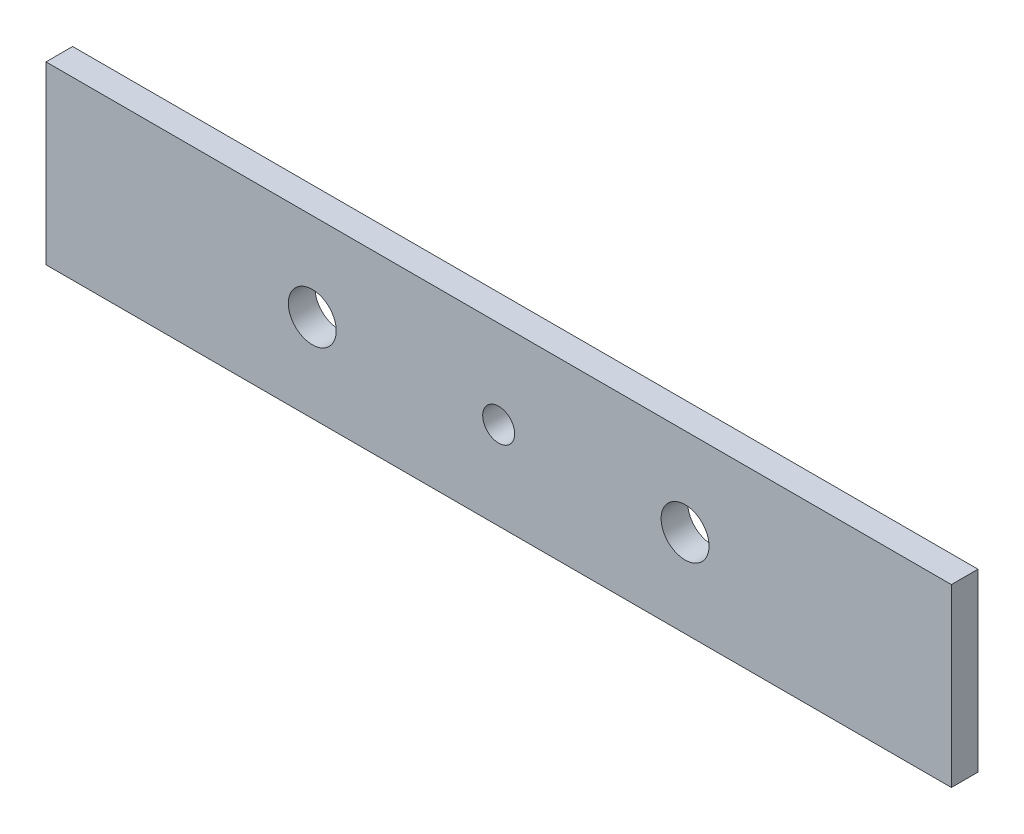
ISO-10303-21;
HEADER;
FILE_DESCRIPTION(('STEP AP214'),'2;1');
FILE_NAME('part.step','',(''),(''),'','','');
FILE_SCHEMA(('AUTOMOTIVE_DESIGN { 1 0 10303 214 1 1 1 1 }'));
ENDSEC;
DATA;
#1=APPLICATION_CONTEXT('core data for automotive mechanical design processes');
#2=APPLICATION_PROTOCOL_DEFINITION('international standard','automotive_design',2000,#1);
#3=PRODUCT_CONTEXT('',#1,'mechanical');
#4=PRODUCT('Part','Part','',(#3));
#5=PRODUCT_RELATED_PRODUCT_CATEGORY('part','',(#4));
#6=PRODUCT_DEFINITION_FORMATION('','',#4);
#7=PRODUCT_DEFINITION_CONTEXT('part definition',#1,'design');
#8=PRODUCT_DEFINITION('design','',#6,#7);
#9=PRODUCT_DEFINITION_SHAPE('','',#8);
#10=(LENGTH_UNIT() NAMED_UNIT(*) SI_UNIT(.MILLI.,.METRE.));
#11=(NAMED_UNIT(*) PLANE_ANGLE_UNIT() SI_UNIT($,.RADIAN.));
#12=(NAMED_UNIT(*) SI_UNIT($,.STERADIAN.) SOLID_ANGLE_UNIT());
#13=UNCERTAINTY_MEASURE_WITH_UNIT(LENGTH_MEASURE(1.E-05),#10,'distance_accuracy_value','');
#14=(GEOMETRIC_REPRESENTATION_CONTEXT(3) GLOBAL_UNCERTAINTY_ASSIGNED_CONTEXT((#13)) GLOBAL_UNIT_ASSIGNED_CONTEXT((#10,
#11,#12)) REPRESENTATION_CONTEXT('',''));
#15=CARTESIAN_POINT('',(0.,0.,0.));
#16=DIRECTION('',(0.,0.,1.));
#17=DIRECTION('',(1.,0.,0.));
#18=AXIS2_PLACEMENT_3D('',#15,#16,#17);
#19=CARTESIAN_POINT('',(0.,33.,0.));
#20=DIRECTION('',(1.,0.,0.));
#21=DIRECTION('',(0.,0.,-1.));
#22=AXIS2_PLACEMENT_3D('',#19,#20,#21);
#23=PLANE('',#22);
#24=DIRECTION('',(0.,0.,1.));
#25=VECTOR('',#24,1.);
#26=CARTESIAN_POINT('',(0.,0.,0.));
#27=LINE('',#26,#25);
#28=CARTESIAN_POINT('',(0.,0.,-5.));
#29=VERTEX_POINT('',#28);
#30=CARTESIAN_POINT('',(0.,0.,0.));
#31=VERTEX_POINT('',#30);
#32=EDGE_CURVE('E98',#29,#31,#27,.T.);
#33=ORIENTED_EDGE('',*,*,#32,.T.);
#34=DIRECTION('',(0.,-1.,0.));
#35=VECTOR('',#34,1.);
#36=CARTESIAN_POINT('',(0.,33.,0.));
#37=LINE('',#36,#35);
#38=CARTESIAN_POINT('',(0.,33.,0.));
#39=VERTEX_POINT('',#38);
#40=EDGE_CURVE('E11',#39,#31,#37,.T.);
#41=ORIENTED_EDGE('',*,*,#40,.F.);
#42=DIRECTION('',(0.,0.,1.));
#43=VECTOR('',#42,1.);
#44=CARTESIAN_POINT('',(0.,33.,0.));
#45=LINE('',#44,#43);
#46=CARTESIAN_POINT('',(0.,33.,-5.));
#47=VERTEX_POINT('',#46);
#48=EDGE_CURVE('E85',#47,#39,#45,.T.);
#49=ORIENTED_EDGE('',*,*,#48,.F.);
#50=DIRECTION('',(0.,-1.,0.));
#51=VECTOR('',#50,1.);
#52=CARTESIAN_POINT('',(0.,33.,-5.));
#53=LINE('',#52,#51);
#54=EDGE_CURVE('E94',#47,#29,#53,.T.);
#55=ORIENTED_EDGE('',*,*,#54,.T.);
#56=EDGE_LOOP('',(#33,#41,#49,#55));
#57=FACE_BOUND('',#56,.T.);
#58=ADVANCED_FACE('F32',(#57),#23,.F.);
#59=CARTESIAN_POINT('',(0.,33.,0.));
#60=DIRECTION('',(0.,0.,-1.));
#61=DIRECTION('',(-1.,0.,0.));
#62=AXIS2_PLACEMENT_3D('',#59,#60,#61);
#63=PLANE('',#62);
#64=CARTESIAN_POINT('',(120.,16.5,0.));
#65=DIRECTION('',(0.,0.,1.));
#66=DIRECTION('',(1.,0.,0.));
#67=AXIS2_PLACEMENT_3D('',#64,#65,#66);
#68=CIRCLE('',#67,4.49999999999999);
#69=CARTESIAN_POINT('',(124.5,16.5,0.));
#70=VERTEX_POINT('',#69);
#71=EDGE_CURVE('E209',#70,#70,#68,.T.);
#72=ORIENTED_EDGE('',*,*,#71,.F.);
#73=EDGE_LOOP('',(#72));
#74=FACE_BOUND('',#73,.T.);
#75=CARTESIAN_POINT('',(50.,16.5,0.));
#76=DIRECTION('',(0.,0.,1.));
#77=DIRECTION('',(1.,0.,0.));
#78=AXIS2_PLACEMENT_3D('',#75,#76,#77);
#79=CIRCLE('',#78,4.5);
#80=CARTESIAN_POINT('',(54.5,16.5,0.));
#81=VERTEX_POINT('',#80);
#82=EDGE_CURVE('E206',#81,#81,#79,.T.);
#83=ORIENTED_EDGE('',*,*,#82,.F.);
#84=EDGE_LOOP('',(#83));
#85=FACE_BOUND('',#84,.T.);
#86=CARTESIAN_POINT('',(85.,16.5,0.));
#87=DIRECTION('',(0.,0.,1.));
#88=DIRECTION('',(1.,0.,0.));
#89=AXIS2_PLACEMENT_3D('',#86,#87,#88);
#90=CIRCLE('',#89,3.00000000000001);
#91=CARTESIAN_POINT('',(88.,16.5,0.));
#92=VERTEX_POINT('',#91);
#93=EDGE_CURVE('E109',#92,#92,#90,.T.);
#94=ORIENTED_EDGE('',*,*,#93,.F.);
#95=EDGE_LOOP('',(#94));
#96=FACE_BOUND('',#95,.T.);
#97=DIRECTION('',(1.,0.,0.));
#98=VECTOR('',#97,1.);
#99=CARTESIAN_POINT('',(0.,0.,0.));
#100=LINE('',#99,#98);
#101=CARTESIAN_POINT('',(170.,0.,0.));
#102=VERTEX_POINT('',#101);
#103=EDGE_CURVE('E89',#31,#102,#100,.T.);
#104=ORIENTED_EDGE('',*,*,#103,.T.);
#105=DIRECTION('',(0.,-1.,0.));
#106=VECTOR('',#105,1.);
#107=CARTESIAN_POINT('',(170.,33.,0.));
#108=LINE('',#107,#106);
#109=CARTESIAN_POINT('',(170.,33.,0.));
#110=VERTEX_POINT('',#109);
#111=EDGE_CURVE('E41',#110,#102,#108,.T.);
#112=ORIENTED_EDGE('',*,*,#111,.F.);
#113=DIRECTION('',(1.,0.,0.));
#114=VECTOR('',#113,1.);
#115=CARTESIAN_POINT('',(0.,33.,0.));
#116=LINE('',#115,#114);
#117=EDGE_CURVE('E80',#39,#110,#116,.T.);
#118=ORIENTED_EDGE('',*,*,#117,.F.);
#119=ORIENTED_EDGE('',*,*,#40,.T.);
#120=EDGE_LOOP('',(#104,#112,#118,#119));
#121=FACE_BOUND('',#120,.T.);
#122=ADVANCED_FACE('F88',(#74,#85,#96,#121),#63,.F.);
#123=CARTESIAN_POINT('',(170.,33.,0.));
#124=DIRECTION('',(-1.,0.,0.));
#125=DIRECTION('',(0.,0.,1.));
#126=AXIS2_PLACEMENT_3D('',#123,#124,#125);
#127=PLANE('',#126);
#128=DIRECTION('',(0.,0.,-1.));
#129=VECTOR('',#128,1.);
#130=CARTESIAN_POINT('',(170.,0.,0.));
#131=LINE('',#130,#129);
#132=CARTESIAN_POINT('',(170.,0.,-5.));
#133=VERTEX_POINT('',#132);
#134=EDGE_CURVE('E67',#102,#133,#131,.T.);
#135=ORIENTED_EDGE('',*,*,#134,.T.);
#136=DIRECTION('',(0.,-1.,0.));
#137=VECTOR('',#136,1.);
#138=CARTESIAN_POINT('',(170.,33.,-5.));
#139=LINE('',#138,#137);
#140=CARTESIAN_POINT('',(170.,33.,-5.));
#141=VERTEX_POINT('',#140);
#142=EDGE_CURVE('E90',#141,#133,#139,.T.);
#143=ORIENTED_EDGE('',*,*,#142,.F.);
#144=DIRECTION('',(0.,0.,-1.));
#145=VECTOR('',#144,1.);
#146=CARTESIAN_POINT('',(170.,33.,0.));
#147=LINE('',#146,#145);
#148=EDGE_CURVE('E83',#110,#141,#147,.T.);
#149=ORIENTED_EDGE('',*,*,#148,.F.);
#150=ORIENTED_EDGE('',*,*,#111,.T.);
#151=EDGE_LOOP('',(#135,#143,#149,#150));
#152=FACE_BOUND('',#151,.T.);
#153=ADVANCED_FACE('F92',(#152),#127,.F.);
#154=CARTESIAN_POINT('',(0.,33.,-5.));
#155=DIRECTION('',(0.,0.,1.));
#156=DIRECTION('',(1.,0.,0.));
#157=AXIS2_PLACEMENT_3D('',#154,#155,#156);
#158=PLANE('',#157);
#159=CARTESIAN_POINT('',(120.,16.5,-5.));
#160=DIRECTION('',(0.,0.,1.));
#161=DIRECTION('',(1.,0.,0.));
#162=AXIS2_PLACEMENT_3D('',#159,#160,#161);
#163=CIRCLE('',#162,4.49999999999999);
#164=CARTESIAN_POINT('',(124.5,16.5,-5.));
#165=VERTEX_POINT('',#164);
#166=EDGE_CURVE('E35',#165,#165,#163,.T.);
#167=ORIENTED_EDGE('',*,*,#166,.T.);
#168=EDGE_LOOP('',(#167));
#169=FACE_BOUND('',#168,.T.);
#170=CARTESIAN_POINT('',(50.,16.5,-5.));
#171=DIRECTION('',(0.,0.,1.));
#172=DIRECTION('',(1.,0.,0.));
#173=AXIS2_PLACEMENT_3D('',#170,#171,#172);
#174=CIRCLE('',#173,4.5);
#175=CARTESIAN_POINT('',(54.5,16.5,-5.));
#176=VERTEX_POINT('',#175);
#177=EDGE_CURVE('E108',#176,#176,#174,.T.);
#178=ORIENTED_EDGE('',*,*,#177,.T.);
#179=EDGE_LOOP('',(#178));
#180=FACE_BOUND('',#179,.T.);
#181=CARTESIAN_POINT('',(85.,16.5,-5.));
#182=DIRECTION('',(0.,0.,1.));
#183=DIRECTION('',(1.,0.,0.));
#184=AXIS2_PLACEMENT_3D('',#181,#182,#183);
#185=CIRCLE('',#184,3.00000000000001);
#186=CARTESIAN_POINT('',(88.,16.5,-5.));
#187=VERTEX_POINT('',#186);
#188=EDGE_CURVE('E106',#187,#187,#185,.T.);
#189=ORIENTED_EDGE('',*,*,#188,.T.);
#190=EDGE_LOOP('',(#189));
#191=FACE_BOUND('',#190,.T.);
#192=DIRECTION('',(-1.,0.,0.));
#193=VECTOR('',#192,1.);
#194=CARTESIAN_POINT('',(0.,0.,-5.));
#195=LINE('',#194,#193);
#196=EDGE_CURVE('E73',#133,#29,#195,.T.);
#197=ORIENTED_EDGE('',*,*,#196,.T.);
#198=ORIENTED_EDGE('',*,*,#54,.F.);
#199=DIRECTION('',(-1.,0.,0.));
#200=VECTOR('',#199,1.);
#201=CARTESIAN_POINT('',(0.,33.,-5.));
#202=LINE('',#201,#200);
#203=EDGE_CURVE('E50',#141,#47,#202,.T.);
#204=ORIENTED_EDGE('',*,*,#203,.F.);
#205=ORIENTED_EDGE('',*,*,#142,.T.);
#206=EDGE_LOOP('',(#197,#198,#204,#205));
#207=FACE_BOUND('',#206,.T.);
#208=ADVANCED_FACE('F116',(#169,#180,#191,#207),#158,.F.);
#209=CARTESIAN_POINT('',(0.,33.,0.));
#210=DIRECTION('',(0.,-1.,0.));
#211=DIRECTION('',(0.,0.,-1.));
#212=AXIS2_PLACEMENT_3D('',#209,#210,#211);
#213=PLANE('',#212);
#214=ORIENTED_EDGE('',*,*,#48,.T.);
#215=ORIENTED_EDGE('',*,*,#117,.T.);
#216=ORIENTED_EDGE('',*,*,#148,.T.);
#217=ORIENTED_EDGE('',*,*,#203,.T.);
#218=EDGE_LOOP('',(#214,#215,#216,#217));
#219=FACE_BOUND('',#218,.T.);
#220=ADVANCED_FACE('F81',(#219),#213,.F.);
#221=CARTESIAN_POINT('',(0.,0.,0.));
#222=DIRECTION('',(0.,-1.,0.));
#223=DIRECTION('',(0.,0.,-1.));
#224=AXIS2_PLACEMENT_3D('',#221,#222,#223);
#225=PLANE('',#224);
#226=ORIENTED_EDGE('',*,*,#32,.F.);
#227=ORIENTED_EDGE('',*,*,#196,.F.);
#228=ORIENTED_EDGE('',*,*,#134,.F.);
#229=ORIENTED_EDGE('',*,*,#103,.F.);
#230=EDGE_LOOP('',(#226,#227,#228,#229));
#231=FACE_BOUND('',#230,.T.);
#232=ADVANCED_FACE('F139',(#231),#225,.T.);
#233=CARTESIAN_POINT('',(85.,16.5,-29.));
#234=DIRECTION('',(0.,0.,1.));
#235=DIRECTION('',(1.,0.,0.));
#236=AXIS2_PLACEMENT_3D('',#233,#234,#235);
#237=CYLINDRICAL_SURFACE('',#236,3.00000000000001);
#238=CARTESIAN_POINT('',(88.,16.5,0.));
#239=CARTESIAN_POINT('',(88.,16.5,-0.0520833333333334));
#240=CARTESIAN_POINT('',(88.,16.5,-0.104166666666667));
#241=CARTESIAN_POINT('',(88.,16.5,-0.208333333333334));
#242=CARTESIAN_POINT('',(88.,16.5,-0.260416666666667));
#243=CARTESIAN_POINT('',(88.,16.5,-0.364583333333334));
#244=CARTESIAN_POINT('',(88.,16.5,-0.416666666666667));
#245=CARTESIAN_POINT('',(88.,16.5,-0.520833333333334));
#246=CARTESIAN_POINT('',(88.,16.5,-0.572916666666667));
#247=CARTESIAN_POINT('',(88.,16.5,-0.677083333333334));
#248=CARTESIAN_POINT('',(88.,16.5,-0.729166666666667));
#249=CARTESIAN_POINT('',(88.,16.5,-0.833333333333334));
#250=CARTESIAN_POINT('',(88.,16.5,-0.885416666666668));
#251=CARTESIAN_POINT('',(88.,16.5,-0.989583333333334));
#252=CARTESIAN_POINT('',(88.,16.5,-1.04166666666667));
#253=CARTESIAN_POINT('',(88.,16.5,-1.14583333333333));
#254=CARTESIAN_POINT('',(88.,16.5,-1.19791666666667));
#255=CARTESIAN_POINT('',(88.,16.5,-1.30208333333333));
#256=CARTESIAN_POINT('',(88.,16.5,-1.35416666666667));
#257=CARTESIAN_POINT('',(88.,16.5,-1.45833333333333));
#258=CARTESIAN_POINT('',(88.,16.5,-1.51041666666667));
#259=CARTESIAN_POINT('',(88.,16.5,-1.61458333333333));
#260=CARTESIAN_POINT('',(88.,16.5,-1.66666666666667));
#261=CARTESIAN_POINT('',(88.,16.5,-1.77083333333334));
#262=CARTESIAN_POINT('',(88.,16.5,-1.82291666666667));
#263=CARTESIAN_POINT('',(88.,16.5,-1.92708333333334));
#264=CARTESIAN_POINT('',(88.,16.5,-1.97916666666667));
#265=CARTESIAN_POINT('',(88.,16.5,-2.08333333333334));
#266=CARTESIAN_POINT('',(88.,16.5,-2.13541666666667));
#267=CARTESIAN_POINT('',(88.,16.5,-2.23958333333334));
#268=CARTESIAN_POINT('',(88.,16.5,-2.29166666666667));
#269=CARTESIAN_POINT('',(88.,16.5,-2.39583333333334));
#270=CARTESIAN_POINT('',(88.,16.5,-2.44791666666667));
#271=CARTESIAN_POINT('',(88.,16.5,-2.55208333333334));
#272=CARTESIAN_POINT('',(88.,16.5,-2.60416666666667));
#273=CARTESIAN_POINT('',(88.,16.5,-2.70833333333334));
#274=CARTESIAN_POINT('',(88.,16.5,-2.76041666666667));
#275=CARTESIAN_POINT('',(88.,16.5,-2.86458333333334));
#276=CARTESIAN_POINT('',(88.,16.5,-2.91666666666667));
#277=CARTESIAN_POINT('',(88.,16.5,-3.02083333333334));
#278=CARTESIAN_POINT('',(88.,16.5,-3.07291666666667));
#279=CARTESIAN_POINT('',(88.,16.5,-3.17708333333334));
#280=CARTESIAN_POINT('',(88.,16.5,-3.22916666666667));
#281=CARTESIAN_POINT('',(88.,16.5,-3.33333333333334));
#282=CARTESIAN_POINT('',(88.,16.5,-3.38541666666667));
#283=CARTESIAN_POINT('',(88.,16.5,-3.48958333333334));
#284=CARTESIAN_POINT('',(88.,16.5,-3.54166666666667));
#285=CARTESIAN_POINT('',(88.,16.5,-3.64583333333334));
#286=CARTESIAN_POINT('',(88.,16.5,-3.69791666666667));
#287=CARTESIAN_POINT('',(88.,16.5,-3.80208333333334));
#288=CARTESIAN_POINT('',(88.,16.5,-3.85416666666667));
#289=CARTESIAN_POINT('',(88.,16.5,-3.95833333333334));
#290=CARTESIAN_POINT('',(88.,16.5,-4.01041666666667));
#291=CARTESIAN_POINT('',(88.,16.5,-4.11458333333334));
#292=CARTESIAN_POINT('',(88.,16.5,-4.16666666666667));
#293=CARTESIAN_POINT('',(88.,16.5,-4.27083333333334));
#294=CARTESIAN_POINT('',(88.,16.5,-4.32291666666667));
#295=CARTESIAN_POINT('',(88.,16.5,-4.42708333333334));
#296=CARTESIAN_POINT('',(88.,16.5,-4.47916666666667));
#297=CARTESIAN_POINT('',(88.,16.5,-4.58333333333334));
#298=CARTESIAN_POINT('',(88.,16.5,-4.63541666666667));
#299=CARTESIAN_POINT('',(88.,16.5,-4.73958333333334));
#300=CARTESIAN_POINT('',(88.,16.5,-4.79166666666667));
#301=CARTESIAN_POINT('',(88.,16.5,-4.89583333333334));
#302=CARTESIAN_POINT('',(88.,16.5,-4.94791666666667));
#303=CARTESIAN_POINT('',(88.,16.5,-5.));
#304=B_SPLINE_CURVE_WITH_KNOTS('',3,(#238,#239,#240,#241,#242,#243,#244,#245,#246,#247,#248,
#249,#250,#251,#252,#253,#254,#255,#256,#257,#258,#259,#260,#261,#262,#263,#264,#265,#266,#267,
#268,#269,#270,#271,#272,#273,#274,#275,#276,#277,#278,#279,#280,#281,#282,#283,#284,#285,#286,
#287,#288,#289,#290,#291,#292,#293,#294,#295,#296,#297,#298,#299,#300,#301,#302,#303),
.UNSPECIFIED.,.F.,.F.,(4,2,2,2,2,2,2,2,2,2,2,2,2,2,2,2,2,2,2,2,2,2,2,2,2,2,2,2,2,2,2,2,4),(0.,
0.15625,0.3125,0.46875,0.625000000000001,0.781250000000001,0.937500000000001,1.09375,1.25,
1.40625,1.5625,1.71875,1.875,2.03125,2.1875,2.34375,2.5,2.65625,2.8125,2.96875,3.125,3.28125,
3.4375,3.59375,3.75,3.90625,4.0625,4.21875,4.375,4.53125,4.6875,4.84375,5.),.UNSPECIFIED.);
#305=EDGE_CURVE('BSEAM126',#92,#187,#304,.T.);
#306=ORIENTED_EDGE('',*,*,#93,.T.);
#307=ORIENTED_EDGE('',*,*,#188,.F.);
#308=ORIENTED_EDGE('',*,*,#305,.T.);
#309=ORIENTED_EDGE('',*,*,#305,.F.);
#310=EDGE_LOOP('',(#306,#308,#307,#309));
#311=FACE_BOUND('',#310,.T.);
#312=ADVANCED_FACE('F126',(#311),#237,.F.);
#313=CARTESIAN_POINT('',(50.,16.5,-29.));
#314=DIRECTION('',(0.,0.,1.));
#315=DIRECTION('',(1.,0.,0.));
#316=AXIS2_PLACEMENT_3D('',#313,#314,#315);
#317=CYLINDRICAL_SURFACE('',#316,4.5);
#318=CARTESIAN_POINT('',(54.5,16.5,0.));
#319=CARTESIAN_POINT('',(54.5,16.5,-0.0520833333333334));
#320=CARTESIAN_POINT('',(54.5,16.5,-0.104166666666667));
#321=CARTESIAN_POINT('',(54.5,16.5,-0.208333333333334));
#322=CARTESIAN_POINT('',(54.5,16.5,-0.260416666666667));
#323=CARTESIAN_POINT('',(54.5,16.5,-0.364583333333334));
#324=CARTESIAN_POINT('',(54.5,16.5,-0.416666666666667));
#325=CARTESIAN_POINT('',(54.5,16.5,-0.520833333333334));
#326=CARTESIAN_POINT('',(54.5,16.5,-0.572916666666667));
#327=CARTESIAN_POINT('',(54.5,16.5,-0.677083333333334));
#328=CARTESIAN_POINT('',(54.5,16.5,-0.729166666666667));
#329=CARTESIAN_POINT('',(54.5,16.5,-0.833333333333334));
#330=CARTESIAN_POINT('',(54.5,16.5,-0.885416666666668));
#331=CARTESIAN_POINT('',(54.5,16.5,-0.989583333333334));
#332=CARTESIAN_POINT('',(54.5,16.5,-1.04166666666667));
#333=CARTESIAN_POINT('',(54.5,16.5,-1.14583333333333));
#334=CARTESIAN_POINT('',(54.5,16.5,-1.19791666666667));
#335=CARTESIAN_POINT('',(54.5,16.5,-1.30208333333333));
#336=CARTESIAN_POINT('',(54.5,16.5,-1.35416666666667));
#337=CARTESIAN_POINT('',(54.5,16.5,-1.45833333333333));
#338=CARTESIAN_POINT('',(54.5,16.5,-1.51041666666667));
#339=CARTESIAN_POINT('',(54.5,16.5,-1.61458333333333));
#340=CARTESIAN_POINT('',(54.5,16.5,-1.66666666666667));
#341=CARTESIAN_POINT('',(54.5,16.5,-1.77083333333334));
#342=CARTESIAN_POINT('',(54.5,16.5,-1.82291666666667));
#343=CARTESIAN_POINT('',(54.5,16.5,-1.92708333333334));
#344=CARTESIAN_POINT('',(54.5,16.5,-1.97916666666667));
#345=CARTESIAN_POINT('',(54.5,16.5,-2.08333333333334));
#346=CARTESIAN_POINT('',(54.5,16.5,-2.13541666666667));
#347=CARTESIAN_POINT('',(54.5,16.5,-2.23958333333334));
#348=CARTESIAN_POINT('',(54.5,16.5,-2.29166666666667));
#349=CARTESIAN_POINT('',(54.5,16.5,-2.39583333333334));
#350=CARTESIAN_POINT('',(54.5,16.5,-2.44791666666667));
#351=CARTESIAN_POINT('',(54.5,16.5,-2.55208333333334));
#352=CARTESIAN_POINT('',(54.5,16.5,-2.60416666666667));
#353=CARTESIAN_POINT('',(54.5,16.5,-2.70833333333334));
#354=CARTESIAN_POINT('',(54.5,16.5,-2.76041666666667));
#355=CARTESIAN_POINT('',(54.5,16.5,-2.86458333333334));
#356=CARTESIAN_POINT('',(54.5,16.5,-2.91666666666667));
#357=CARTESIAN_POINT('',(54.5,16.5,-3.02083333333334));
#358=CARTESIAN_POINT('',(54.5,16.5,-3.07291666666667));
#359=CARTESIAN_POINT('',(54.5,16.5,-3.17708333333334));
#360=CARTESIAN_POINT('',(54.5,16.5,-3.22916666666667));
#361=CARTESIAN_POINT('',(54.5,16.5,-3.33333333333334));
#362=CARTESIAN_POINT('',(54.5,16.5,-3.38541666666667));
#363=CARTESIAN_POINT('',(54.5,16.5,-3.48958333333334));
#364=CARTESIAN_POINT('',(54.5,16.5,-3.54166666666667));
#365=CARTESIAN_POINT('',(54.5,16.5,-3.64583333333334));
#366=CARTESIAN_POINT('',(54.5,16.5,-3.69791666666667));
#367=CARTESIAN_POINT('',(54.5,16.5,-3.80208333333334));
#368=CARTESIAN_POINT('',(54.5,16.5,-3.85416666666667));
#369=CARTESIAN_POINT('',(54.5,16.5,-3.95833333333334));
#370=CARTESIAN_POINT('',(54.5,16.5,-4.01041666666667));
#371=CARTESIAN_POINT('',(54.5,16.5,-4.11458333333334));
#372=CARTESIAN_POINT('',(54.5,16.5,-4.16666666666667));
#373=CARTESIAN_POINT('',(54.5,16.5,-4.27083333333334));
#374=CARTESIAN_POINT('',(54.5,16.5,-4.32291666666667));
#375=CARTESIAN_POINT('',(54.5,16.5,-4.42708333333334));
#376=CARTESIAN_POINT('',(54.5,16.5,-4.47916666666667));
#377=CARTESIAN_POINT('',(54.5,16.5,-4.58333333333334));
#378=CARTESIAN_POINT('',(54.5,16.5,-4.63541666666667));
#379=CARTESIAN_POINT('',(54.5,16.5,-4.73958333333334));
#380=CARTESIAN_POINT('',(54.5,16.5,-4.79166666666667));
#381=CARTESIAN_POINT('',(54.5,16.5,-4.89583333333334));
#382=CARTESIAN_POINT('',(54.5,16.5,-4.94791666666667));
#383=CARTESIAN_POINT('',(54.5,16.5,-5.));
#384=B_SPLINE_CURVE_WITH_KNOTS('',3,(#318,#319,#320,#321,#322,#323,#324,#325,#326,#327,#328,
#329,#330,#331,#332,#333,#334,#335,#336,#337,#338,#339,#340,#341,#342,#343,#344,#345,#346,#347,
#348,#349,#350,#351,#352,#353,#354,#355,#356,#357,#358,#359,#360,#361,#362,#363,#364,#365,#366,
#367,#368,#369,#370,#371,#372,#373,#374,#375,#376,#377,#378,#379,#380,#381,#382,#383),
.UNSPECIFIED.,.F.,.F.,(4,2,2,2,2,2,2,2,2,2,2,2,2,2,2,2,2,2,2,2,2,2,2,2,2,2,2,2,2,2,2,2,4),(0.,
0.15625,0.3125,0.46875,0.625000000000001,0.781250000000001,0.937500000000001,1.09375,1.25,
1.40625,1.5625,1.71875,1.875,2.03125,2.1875,2.34375,2.5,2.65625,2.8125,2.96875,3.125,3.28125,
3.4375,3.59375,3.75,3.90625,4.0625,4.21875,4.375,4.53125,4.6875,4.84375,5.),.UNSPECIFIED.);
#385=EDGE_CURVE('BSEAM120',#81,#176,#384,.T.);
#386=ORIENTED_EDGE('',*,*,#82,.T.);
#387=ORIENTED_EDGE('',*,*,#177,.F.);
#388=ORIENTED_EDGE('',*,*,#385,.T.);
#389=ORIENTED_EDGE('',*,*,#385,.F.);
#390=EDGE_LOOP('',(#386,#388,#387,#389));
#391=FACE_BOUND('',#390,.T.);
#392=ADVANCED_FACE('F120',(#391),#317,.F.);
#393=CARTESIAN_POINT('',(120.,16.5,-29.));
#394=DIRECTION('',(0.,0.,1.));
#395=DIRECTION('',(1.,0.,0.));
#396=AXIS2_PLACEMENT_3D('',#393,#394,#395);
#397=CYLINDRICAL_SURFACE('',#396,4.49999999999999);
#398=CARTESIAN_POINT('',(124.5,16.5,0.));
#399=CARTESIAN_POINT('',(124.5,16.5,-0.0520833333333334));
#400=CARTESIAN_POINT('',(124.5,16.5,-0.104166666666667));
#401=CARTESIAN_POINT('',(124.5,16.5,-0.208333333333334));
#402=CARTESIAN_POINT('',(124.5,16.5,-0.260416666666667));
#403=CARTESIAN_POINT('',(124.5,16.5,-0.364583333333334));
#404=CARTESIAN_POINT('',(124.5,16.5,-0.416666666666667));
#405=CARTESIAN_POINT('',(124.5,16.5,-0.520833333333334));
#406=CARTESIAN_POINT('',(124.5,16.5,-0.572916666666667));
#407=CARTESIAN_POINT('',(124.5,16.5,-0.677083333333334));
#408=CARTESIAN_POINT('',(124.5,16.5,-0.729166666666667));
#409=CARTESIAN_POINT('',(124.5,16.5,-0.833333333333334));
#410=CARTESIAN_POINT('',(124.5,16.5,-0.885416666666668));
#411=CARTESIAN_POINT('',(124.5,16.5,-0.989583333333334));
#412=CARTESIAN_POINT('',(124.5,16.5,-1.04166666666667));
#413=CARTESIAN_POINT('',(124.5,16.5,-1.14583333333333));
#414=CARTESIAN_POINT('',(124.5,16.5,-1.19791666666667));
#415=CARTESIAN_POINT('',(124.5,16.5,-1.30208333333333));
#416=CARTESIAN_POINT('',(124.5,16.5,-1.35416666666667));
#417=CARTESIAN_POINT('',(124.5,16.5,-1.45833333333333));
#418=CARTESIAN_POINT('',(124.5,16.5,-1.51041666666667));
#419=CARTESIAN_POINT('',(124.5,16.5,-1.61458333333333));
#420=CARTESIAN_POINT('',(124.5,16.5,-1.66666666666667));
#421=CARTESIAN_POINT('',(124.5,16.5,-1.77083333333334));
#422=CARTESIAN_POINT('',(124.5,16.5,-1.82291666666667));
#423=CARTESIAN_POINT('',(124.5,16.5,-1.92708333333334));
#424=CARTESIAN_POINT('',(124.5,16.5,-1.97916666666667));
#425=CARTESIAN_POINT('',(124.5,16.5,-2.08333333333334));
#426=CARTESIAN_POINT('',(124.5,16.5,-2.13541666666667));
#427=CARTESIAN_POINT('',(124.5,16.5,-2.23958333333334));
#428=CARTESIAN_POINT('',(124.5,16.5,-2.29166666666667));
#429=CARTESIAN_POINT('',(124.5,16.5,-2.39583333333334));
#430=CARTESIAN_POINT('',(124.5,16.5,-2.44791666666667));
#431=CARTESIAN_POINT('',(124.5,16.5,-2.55208333333334));
#432=CARTESIAN_POINT('',(124.5,16.5,-2.60416666666667));
#433=CARTESIAN_POINT('',(124.5,16.5,-2.70833333333334));
#434=CARTESIAN_POINT('',(124.5,16.5,-2.76041666666667));
#435=CARTESIAN_POINT('',(124.5,16.5,-2.86458333333334));
#436=CARTESIAN_POINT('',(124.5,16.5,-2.91666666666667));
#437=CARTESIAN_POINT('',(124.5,16.5,-3.02083333333334));
#438=CARTESIAN_POINT('',(124.5,16.5,-3.07291666666667));
#439=CARTESIAN_POINT('',(124.5,16.5,-3.17708333333334));
#440=CARTESIAN_POINT('',(124.5,16.5,-3.22916666666667));
#441=CARTESIAN_POINT('',(124.5,16.5,-3.33333333333334));
#442=CARTESIAN_POINT('',(124.5,16.5,-3.38541666666667));
#443=CARTESIAN_POINT('',(124.5,16.5,-3.48958333333334));
#444=CARTESIAN_POINT('',(124.5,16.5,-3.54166666666667));
#445=CARTESIAN_POINT('',(124.5,16.5,-3.64583333333334));
#446=CARTESIAN_POINT('',(124.5,16.5,-3.69791666666667));
#447=CARTESIAN_POINT('',(124.5,16.5,-3.80208333333334));
#448=CARTESIAN_POINT('',(124.5,16.5,-3.85416666666667));
#449=CARTESIAN_POINT('',(124.5,16.5,-3.95833333333334));
#450=CARTESIAN_POINT('',(124.5,16.5,-4.01041666666667));
#451=CARTESIAN_POINT('',(124.5,16.5,-4.11458333333334));
#452=CARTESIAN_POINT('',(124.5,16.5,-4.16666666666667));
#453=CARTESIAN_POINT('',(124.5,16.5,-4.27083333333334));
#454=CARTESIAN_POINT('',(124.5,16.5,-4.32291666666667));
#455=CARTESIAN_POINT('',(124.5,16.5,-4.42708333333334));
#456=CARTESIAN_POINT('',(124.5,16.5,-4.47916666666667));
#457=CARTESIAN_POINT('',(124.5,16.5,-4.58333333333334));
#458=CARTESIAN_POINT('',(124.5,16.5,-4.63541666666667));
#459=CARTESIAN_POINT('',(124.5,16.5,-4.73958333333334));
#460=CARTESIAN_POINT('',(124.5,16.5,-4.79166666666667));
#461=CARTESIAN_POINT('',(124.5,16.5,-4.89583333333334));
#462=CARTESIAN_POINT('',(124.5,16.5,-4.94791666666667));
#463=CARTESIAN_POINT('',(124.5,16.5,-5.));
#464=B_SPLINE_CURVE_WITH_KNOTS('',3,(#398,#399,#400,#401,#402,#403,#404,#405,#406,#407,#408,
#409,#410,#411,#412,#413,#414,#415,#416,#417,#418,#419,#420,#421,#422,#423,#424,#425,#426,#427,
#428,#429,#430,#431,#432,#433,#434,#435,#436,#437,#438,#439,#440,#441,#442,#443,#444,#445,#446,
#447,#448,#449,#450,#451,#452,#453,#454,#455,#456,#457,#458,#459,#460,#461,#462,#463),
.UNSPECIFIED.,.F.,.F.,(4,2,2,2,2,2,2,2,2,2,2,2,2,2,2,2,2,2,2,2,2,2,2,2,2,2,2,2,2,2,2,2,4),(0.,
0.15625,0.3125,0.46875,0.625000000000001,0.781250000000001,0.937500000000001,1.09375,1.25,
1.40625,1.5625,1.71875,1.875,2.03125,2.1875,2.34375,2.5,2.65625,2.8125,2.96875,3.125,3.28125,
3.4375,3.59375,3.75,3.90625,4.0625,4.21875,4.375,4.53125,4.6875,4.84375,5.),.UNSPECIFIED.);
#465=EDGE_CURVE('BSEAM118',#70,#165,#464,.T.);
#466=ORIENTED_EDGE('',*,*,#71,.T.);
#467=ORIENTED_EDGE('',*,*,#166,.F.);
#468=ORIENTED_EDGE('',*,*,#465,.T.);
#469=ORIENTED_EDGE('',*,*,#465,.F.);
#470=EDGE_LOOP('',(#466,#468,#467,#469));
#471=FACE_BOUND('',#470,.T.);
#472=ADVANCED_FACE('F118',(#471),#397,.F.);
#473=CLOSED_SHELL('',(#58,#122,#153,#208,#220,#232,#312,#392,#472));
#474=MANIFOLD_SOLID_BREP('B2',#473);
#475=ADVANCED_BREP_SHAPE_REPRESENTATION('',(#18,#474),#14);
#476=SHAPE_DEFINITION_REPRESENTATION(#9,#475);
ENDSEC;
END-ISO-10303-21;
